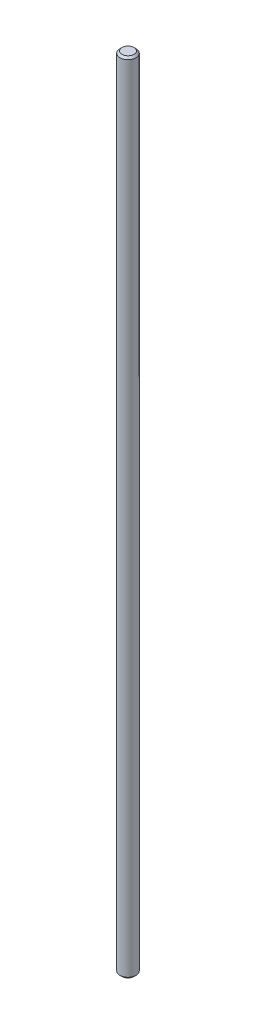
ISO-10303-21;
HEADER;
FILE_DESCRIPTION(('STEP AP214'),'2;1');
FILE_NAME('part.step','',(''),(''),'','','');
FILE_SCHEMA(('AUTOMOTIVE_DESIGN { 1 0 10303 214 1 1 1 1 }'));
ENDSEC;
DATA;
#1=APPLICATION_CONTEXT('core data for automotive mechanical design processes');
#2=APPLICATION_PROTOCOL_DEFINITION('international standard','automotive_design',2000,#1);
#3=PRODUCT_CONTEXT('',#1,'mechanical');
#4=PRODUCT('Part','Part','',(#3));
#5=PRODUCT_RELATED_PRODUCT_CATEGORY('part','',(#4));
#6=PRODUCT_DEFINITION_FORMATION('','',#4);
#7=PRODUCT_DEFINITION_CONTEXT('part definition',#1,'design');
#8=PRODUCT_DEFINITION('design','',#6,#7);
#9=PRODUCT_DEFINITION_SHAPE('','',#8);
#10=(LENGTH_UNIT() NAMED_UNIT(*) SI_UNIT(.MILLI.,.METRE.));
#11=(NAMED_UNIT(*) PLANE_ANGLE_UNIT() SI_UNIT($,.RADIAN.));
#12=(NAMED_UNIT(*) SI_UNIT($,.STERADIAN.) SOLID_ANGLE_UNIT());
#13=UNCERTAINTY_MEASURE_WITH_UNIT(LENGTH_MEASURE(1.E-05),#10,'distance_accuracy_value','');
#14=(GEOMETRIC_REPRESENTATION_CONTEXT(3) GLOBAL_UNCERTAINTY_ASSIGNED_CONTEXT((#13)) GLOBAL_UNIT_ASSIGNED_CONTEXT((#10,
#11,#12)) REPRESENTATION_CONTEXT('',''));
#15=CARTESIAN_POINT('',(0.,0.,0.));
#16=DIRECTION('',(0.,0.,1.));
#17=DIRECTION('',(1.,0.,0.));
#18=AXIS2_PLACEMENT_3D('',#15,#16,#17);
#19=CARTESIAN_POINT('',(0.,400000.,0.));
#20=DIRECTION('',(0.,-1.,0.));
#21=DIRECTION('',(0.,0.,-1.));
#22=AXIS2_PLACEMENT_3D('',#19,#20,#21);
#23=CYLINDRICAL_SURFACE('',#22,4000.);
#24=CARTESIAN_POINT('',(0.,1000.,0.));
#25=DIRECTION('',(0.,1.,0.));
#26=DIRECTION('',(0.,0.,1.));
#27=AXIS2_PLACEMENT_3D('',#24,#25,#26);
#28=CIRCLE('',#27,4000.);
#29=CARTESIAN_POINT('',(0.,1000.,4000.));
#30=VERTEX_POINT('',#29);
#31=EDGE_CURVE('E42',#30,#30,#28,.T.);
#32=ORIENTED_EDGE('',*,*,#31,.T.);
#33=EDGE_LOOP('',(#32));
#34=FACE_BOUND('',#33,.T.);
#35=CARTESIAN_POINT('',(0.,399000.,0.));
#36=DIRECTION('',(0.,1.,0.));
#37=DIRECTION('',(0.,0.,1.));
#38=AXIS2_PLACEMENT_3D('',#35,#36,#37);
#39=CIRCLE('',#38,4000.);
#40=CARTESIAN_POINT('',(0.,399000.,4000.));
#41=VERTEX_POINT('',#40);
#42=EDGE_CURVE('E46',#41,#41,#39,.F.);
#43=ORIENTED_EDGE('',*,*,#42,.T.);
#44=EDGE_LOOP('',(#43));
#45=FACE_BOUND('',#44,.T.);
#46=ADVANCED_FACE('F31',(#34,#45),#23,.T.);
#47=CARTESIAN_POINT('',(0.,400000.,0.));
#48=DIRECTION('',(0.,1.,0.));
#49=DIRECTION('',(0.,0.,1.));
#50=AXIS2_PLACEMENT_3D('',#47,#48,#49);
#51=PLANE('',#50);
#52=CARTESIAN_POINT('',(0.,400000.,0.));
#53=DIRECTION('',(0.,1.,0.));
#54=DIRECTION('',(0.,0.,1.));
#55=AXIS2_PLACEMENT_3D('',#52,#53,#54);
#56=CIRCLE('',#55,3000.00000000011);
#57=CARTESIAN_POINT('',(0.,400000.,3000.00000000011));
#58=VERTEX_POINT('',#57);
#59=EDGE_CURVE('E10',#58,#58,#56,.T.);
#60=ORIENTED_EDGE('',*,*,#59,.T.);
#61=EDGE_LOOP('',(#60));
#62=FACE_BOUND('',#61,.T.);
#63=ADVANCED_FACE('F62',(#62),#51,.T.);
#64=CARTESIAN_POINT('',(0.,0.,0.));
#65=DIRECTION('',(0.,1.,0.));
#66=DIRECTION('',(0.,0.,1.));
#67=AXIS2_PLACEMENT_3D('',#64,#65,#66);
#68=PLANE('',#67);
#69=CARTESIAN_POINT('',(0.,0.,0.));
#70=DIRECTION('',(0.,1.,0.));
#71=DIRECTION('',(0.,0.,1.));
#72=AXIS2_PLACEMENT_3D('',#69,#70,#71);
#73=CIRCLE('',#72,3000.00000000006);
#74=CARTESIAN_POINT('',(0.,0.,3000.00000000006));
#75=VERTEX_POINT('',#74);
#76=EDGE_CURVE('E38',#75,#75,#73,.F.);
#77=ORIENTED_EDGE('',*,*,#76,.T.);
#78=EDGE_LOOP('',(#77));
#79=FACE_BOUND('',#78,.T.);
#80=ADVANCED_FACE('F59',(#79),#68,.F.);
#81=CARTESIAN_POINT('',(0.,1000.,0.));
#82=DIRECTION('',(0.,1.,0.));
#83=DIRECTION('',(0.,0.,1.));
#84=AXIS2_PLACEMENT_3D('',#81,#82,#83);
#85=CONICAL_SURFACE('',#84,4000.,0.78539816339742);
#86=ORIENTED_EDGE('',*,*,#76,.F.);
#87=EDGE_LOOP('',(#86));
#88=FACE_BOUND('',#87,.T.);
#89=ORIENTED_EDGE('',*,*,#31,.F.);
#90=EDGE_LOOP('',(#89));
#91=FACE_BOUND('',#90,.T.);
#92=ADVANCED_FACE('F55',(#88,#91),#85,.T.);
#93=CARTESIAN_POINT('',(0.,400000.,0.));
#94=DIRECTION('',(0.,-1.,0.));
#95=DIRECTION('',(0.,0.,-1.));
#96=AXIS2_PLACEMENT_3D('',#93,#94,#95);
#97=CONICAL_SURFACE('',#96,3000.00000000011,0.785398163397448);
#98=ORIENTED_EDGE('',*,*,#42,.F.);
#99=EDGE_LOOP('',(#98));
#100=FACE_BOUND('',#99,.T.);
#101=ORIENTED_EDGE('',*,*,#59,.F.);
#102=EDGE_LOOP('',(#101));
#103=FACE_BOUND('',#102,.T.);
#104=ADVANCED_FACE('F33',(#100,#103),#97,.T.);
#105=CLOSED_SHELL('',(#46,#63,#80,#92,#104));
#106=MANIFOLD_SOLID_BREP('B2',#105);
#107=ADVANCED_BREP_SHAPE_REPRESENTATION('',(#18,#106),#14);
#108=SHAPE_DEFINITION_REPRESENTATION(#9,#107);
ENDSEC;
END-ISO-10303-21;
